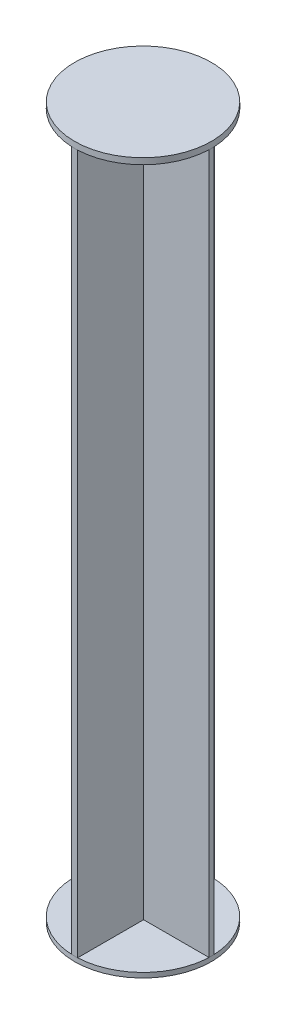
ISO-10303-21;
HEADER;
FILE_DESCRIPTION(('STEP AP214'),'2;1');
FILE_NAME('part.step','',(''),(''),'','','');
FILE_SCHEMA(('AUTOMOTIVE_DESIGN { 1 0 10303 214 1 1 1 1 }'));
ENDSEC;
DATA;
#1=APPLICATION_CONTEXT('core data for automotive mechanical design processes');
#2=APPLICATION_PROTOCOL_DEFINITION('international standard','automotive_design',2000,#1);
#3=PRODUCT_CONTEXT('',#1,'mechanical');
#4=PRODUCT('Part','Part','',(#3));
#5=PRODUCT_RELATED_PRODUCT_CATEGORY('part','',(#4));
#6=PRODUCT_DEFINITION_FORMATION('','',#4);
#7=PRODUCT_DEFINITION_CONTEXT('part definition',#1,'design');
#8=PRODUCT_DEFINITION('design','',#6,#7);
#9=PRODUCT_DEFINITION_SHAPE('','',#8);
#10=(LENGTH_UNIT() NAMED_UNIT(*) SI_UNIT(.MILLI.,.METRE.));
#11=(NAMED_UNIT(*) PLANE_ANGLE_UNIT() SI_UNIT($,.RADIAN.));
#12=(NAMED_UNIT(*) SI_UNIT($,.STERADIAN.) SOLID_ANGLE_UNIT());
#13=UNCERTAINTY_MEASURE_WITH_UNIT(LENGTH_MEASURE(1.E-05),#10,'distance_accuracy_value','');
#14=(GEOMETRIC_REPRESENTATION_CONTEXT(3) GLOBAL_UNCERTAINTY_ASSIGNED_CONTEXT((#13)) GLOBAL_UNIT_ASSIGNED_CONTEXT((#10,
#11,#12)) REPRESENTATION_CONTEXT('',''));
#15=CARTESIAN_POINT('',(0.,0.,0.));
#16=DIRECTION('',(0.,0.,1.));
#17=DIRECTION('',(1.,0.,0.));
#18=AXIS2_PLACEMENT_3D('',#15,#16,#17);
#19=CARTESIAN_POINT('',(0.,115.8,0.));
#20=DIRECTION('',(0.,1.,0.));
#21=DIRECTION('',(0.,0.,1.));
#22=AXIS2_PLACEMENT_3D('',#19,#20,#21);
#23=PLANE('',#22);
#24=DIRECTION('',(0.,0.,-1.));
#25=VECTOR('',#24,1.);
#26=CARTESIAN_POINT('',(-0.5,115.8,11.25));
#27=LINE('',#26,#25);
#28=CARTESIAN_POINT('',(-0.499992884047757,115.8,-11.23904034181));
#29=VERTEX_POINT('',#28);
#30=CARTESIAN_POINT('',(-0.5,115.8,-11.25));
#31=VERTEX_POINT('',#30);
#32=EDGE_CURVE('E249',#29,#31,#27,.T.);
#33=ORIENTED_EDGE('',*,*,#32,.F.);
#34=CARTESIAN_POINT('',(-0.500000018548288,115.8,-11.2391966535701));
#35=CARTESIAN_POINT('',(-0.251080948261474,115.8,-11.2499832612701));
#36=CARTESIAN_POINT('',(0.,115.8,-11.25));
#37=CARTESIAN_POINT('',(0.000388933017916641,115.8,-11.2500000259289));
#38=CARTESIAN_POINT('',(0.000777860932115055,115.8,-11.2500000259627));
#39=B_SPLINE_CURVE_WITH_KNOTS('',2,(#34,#35,#36,#37,#38),.UNSPECIFIED.,.F.,.F.,(3,2,3),
(0.492989743015416,0.5,0.500010866410439),.UNSPECIFIED.);
#40=CARTESIAN_POINT('',(0.000777850721207381,115.8,-11.2499999995357));
#41=VERTEX_POINT('',#40);
#42=EDGE_CURVE('E12',#29,#41,#39,.T.);
#43=ORIENTED_EDGE('',*,*,#42,.T.);
#44=DIRECTION('',(1.,0.,0.));
#45=VECTOR('',#44,1.);
#46=CARTESIAN_POINT('',(-0.5,115.8,-11.25));
#47=LINE('',#46,#45);
#48=EDGE_CURVE('E230',#31,#41,#47,.T.);
#49=ORIENTED_EDGE('',*,*,#48,.F.);
#50=EDGE_LOOP('',(#33,#43,#49));
#51=FACE_BOUND('',#50,.T.);
#52=ADVANCED_FACE('F58',(#51),#23,.T.);
#53=CARTESIAN_POINT('',(0.5,115.8,-11.25));
#54=VERTEX_POINT('',#53);
#55=EDGE_CURVE('E228',#41,#54,#47,.T.);
#56=ORIENTED_EDGE('',*,*,#55,.F.);
#57=CARTESIAN_POINT('',(0.000777860932115055,115.8,-11.2500000259627));
#58=CARTESIAN_POINT('',(0.251448981939054,115.8,-11.2500000477347));
#59=CARTESIAN_POINT('',(0.500000000000019,115.8,-11.2392431539296));
#60=B_SPLINE_CURVE_WITH_KNOTS('',2,(#57,#58,#59),.UNSPECIFIED.,.F.,.F.,(3,3),(0.500010866410439,
0.507014465757992),.UNSPECIFIED.);
#61=CARTESIAN_POINT('',(0.499991796669695,115.8,-11.2390636400938));
#62=VERTEX_POINT('',#61);
#63=EDGE_CURVE('E70',#41,#62,#60,.T.);
#64=ORIENTED_EDGE('',*,*,#63,.T.);
#65=DIRECTION('',(0.,0.,-1.));
#66=VECTOR('',#65,1.);
#67=CARTESIAN_POINT('',(0.5,115.8,11.25));
#68=LINE('',#67,#66);
#69=EDGE_CURVE('E235',#62,#54,#68,.T.);
#70=ORIENTED_EDGE('',*,*,#69,.T.);
#71=EDGE_LOOP('',(#56,#64,#70));
#72=FACE_BOUND('',#71,.T.);
#73=ADVANCED_FACE('F285',(#72),#23,.T.);
#74=DIRECTION('',(1.,0.,0.));
#75=VECTOR('',#74,1.);
#76=CARTESIAN_POINT('',(-0.5,115.8,11.25));
#77=LINE('',#76,#75);
#78=CARTESIAN_POINT('',(-0.5,115.8,11.25));
#79=VERTEX_POINT('',#78);
#80=CARTESIAN_POINT('',(0.,115.8,11.25));
#81=VERTEX_POINT('',#80);
#82=EDGE_CURVE('E268',#79,#81,#77,.T.);
#83=ORIENTED_EDGE('',*,*,#82,.T.);
#84=CARTESIAN_POINT('',(0.,115.8,11.25));
#85=CARTESIAN_POINT('',(-0.251067571600943,115.8,11.25));
#86=CARTESIAN_POINT('',(-0.500000000000012,115.8,11.2392165445393));
#87=B_SPLINE_CURVE_WITH_KNOTS('',2,(#84,#85,#86),.UNSPECIFIED.,.F.,.F.,(3,3),(0.,
0.00701345487662343),.UNSPECIFIED.);
#88=CARTESIAN_POINT('',(-0.499992410309522,115.8,11.2390503081084));
#89=VERTEX_POINT('',#88);
#90=EDGE_CURVE('E77',#81,#89,#87,.T.);
#91=ORIENTED_EDGE('',*,*,#90,.T.);
#92=EDGE_CURVE('E263',#79,#89,#27,.T.);
#93=ORIENTED_EDGE('',*,*,#92,.F.);
#94=EDGE_LOOP('',(#83,#91,#93));
#95=FACE_BOUND('',#94,.T.);
#96=ADVANCED_FACE('F611',(#95),#23,.T.);
#97=CARTESIAN_POINT('',(0.5,115.8,11.25));
#98=VERTEX_POINT('',#97);
#99=CARTESIAN_POINT('',(0.499992256768865,115.8,11.2390536781248));
#100=VERTEX_POINT('',#99);
#101=EDGE_CURVE('E219',#98,#100,#68,.T.);
#102=ORIENTED_EDGE('',*,*,#101,.T.);
#103=CARTESIAN_POINT('',(0.,115.8,0.));
#104=DIRECTION('',(0.,1.,0.));
#105=DIRECTION('',(0.,0.,1.));
#106=AXIS2_PLACEMENT_3D('',#103,#104,#105);
#107=CIRCLE('',#106,11.25);
#108=EDGE_CURVE('E201',#81,#100,#107,.T.);
#109=ORIENTED_EDGE('',*,*,#108,.F.);
#110=EDGE_CURVE('E227',#81,#98,#77,.T.);
#111=ORIENTED_EDGE('',*,*,#110,.T.);
#112=EDGE_LOOP('',(#102,#109,#111));
#113=FACE_BOUND('',#112,.T.);
#114=ADVANCED_FACE('F226',(#113),#23,.T.);
#115=CARTESIAN_POINT('',(0.,0.8,0.));
#116=DIRECTION('',(0.,1.,0.));
#117=DIRECTION('',(0.,0.,1.));
#118=AXIS2_PLACEMENT_3D('',#115,#116,#117);
#119=PLANE('',#118);
#120=CARTESIAN_POINT('',(-11.2431368122212,0.8,0.399881608208691));
#121=CARTESIAN_POINT('',(-11.2371022648922,0.8,0.575100187084233));
#122=CARTESIAN_POINT('',(-11.2270254597995,0.8,0.750185275564195));
#123=CARTESIAN_POINT('',(-11.1987828675933,0.8,1.0987651871348));
#124=CARTESIAN_POINT('',(-11.1806603079024,0.8,1.27226351811985));
#125=CARTESIAN_POINT('',(-11.1363289411508,0.8,1.61767140104678));
#126=CARTESIAN_POINT('',(-11.110145744357,0.8,1.78958423360837));
#127=CARTESIAN_POINT('',(-11.04971494931,0.8,2.1318210715336));
#128=CARTESIAN_POINT('',(-11.0154749133745,0.8,2.30214641203714));
#129=CARTESIAN_POINT('',(-10.9389478313195,0.8,2.64121008557803));
#130=CARTESIAN_POINT('',(-10.8966504414756,0.8,2.80994608282852));
#131=CARTESIAN_POINT('',(-10.8040260345965,0.8,3.14583738007681));
#132=CARTESIAN_POINT('',(-10.7536713725706,0.8,3.31298505938041));
#133=CARTESIAN_POINT('',(-10.6539832145079,0.8,3.61805980800583));
#134=CARTESIAN_POINT('',(-10.6057893389874,0.8,3.75636072727532));
#135=CARTESIAN_POINT('',(-10.5038261089558,0.8,4.03186562456647));
#136=CARTESIAN_POINT('',(-10.4500239798293,0.8,4.16905745179072));
#137=CARTESIAN_POINT('',(-10.3151022454062,0.8,4.4948343304675));
#138=CARTESIAN_POINT('',(-10.2315582080898,0.8,4.68242155489145));
#139=CARTESIAN_POINT('',(-10.0551022551234,0.8,5.05138233450371));
#140=CARTESIAN_POINT('',(-9.96226668944249,0.8,5.23279238219571));
#141=CARTESIAN_POINT('',(-9.78103900375733,0.8,5.56421791628082));
#142=CARTESIAN_POINT('',(-9.69396901099918,0.8,5.71495768857205));
#143=CARTESIAN_POINT('',(-9.51297802348486,0.8,6.01188149241133));
#144=CARTESIAN_POINT('',(-9.41907020493003,0.8,6.15807354962939));
#145=CARTESIAN_POINT('',(-9.22442066633882,0.8,6.44590797969118));
#146=CARTESIAN_POINT('',(-9.12367659817755,0.8,6.58754876438973));
#147=CARTESIAN_POINT('',(-8.91537047030673,0.8,6.86629081540638));
#148=CARTESIAN_POINT('',(-8.807791558606,0.8,7.00337948368777));
#149=CARTESIAN_POINT('',(-8.58053953607552,0.8,7.27945387245167));
#150=CARTESIAN_POINT('',(-8.46052797520128,0.8,7.41816103963735));
#151=CARTESIAN_POINT('',(-8.21305819023556,0.8,7.69062427004085));
#152=CARTESIAN_POINT('',(-8.08555180993848,0.8,7.82433656420631));
#153=CARTESIAN_POINT('',(-7.83619411329542,0.8,8.07372137801353));
#154=CARTESIAN_POINT('',(-7.71487852888197,0.8,8.18993022325182));
#155=CARTESIAN_POINT('',(-7.46805902648496,0.8,8.41612583112336));
#156=CARTESIAN_POINT('',(-7.34258841156314,0.8,8.52614890064356));
#157=CARTESIAN_POINT('',(-7.08115277415386,0.8,8.74527827261076));
#158=CARTESIAN_POINT('',(-6.9449693229303,0.8,8.854124213538));
#159=CARTESIAN_POINT('',(-6.66801268614439,0.8,9.06497797898118));
#160=CARTESIAN_POINT('',(-6.52725350794752,0.8,9.16700419970581));
#161=CARTESIAN_POINT('',(-6.24115750143312,0.8,9.36423242254744));
#162=CARTESIAN_POINT('',(-6.09582347978867,0.8,9.45943849575078));
#163=CARTESIAN_POINT('',(-5.80058833032451,0.8,9.64304110121362));
#164=CARTESIAN_POINT('',(-5.65068016270872,0.8,9.73142631305156));
#165=CARTESIAN_POINT('',(-5.34630864565989,0.8,9.90140212370216));
#166=CARTESIAN_POINT('',(-5.19183002744031,0.8,9.9829653556226));
#167=CARTESIAN_POINT('',(-4.87831674523212,0.8,10.1393159929018));
#168=CARTESIAN_POINT('',(-4.71926030220391,0.8,10.2140597955588));
#169=CARTESIAN_POINT('',(-4.47455892752636,0.8,10.3223053734651));
#170=CARTESIAN_POINT('',(-4.39008225598026,0.8,10.3584749027733));
#171=CARTESIAN_POINT('',(-4.18453276590349,0.8,10.4436301877052));
#172=CARTESIAN_POINT('',(-4.06303464722996,0.8,10.4915962811661));
#173=CARTESIAN_POINT('',(-3.81915166999,0.8,10.583095860544));
#174=CARTESIAN_POINT('',(-3.69677544447694,0.8,10.6266524161711));
#175=CARTESIAN_POINT('',(-3.4081799260429,0.8,10.7237978845123));
#176=CARTESIAN_POINT('',(-3.24138007201122,0.8,10.7756737723475));
#177=CARTESIAN_POINT('',(-2.90616359404475,0.8,10.8713402394877));
#178=CARTESIAN_POINT('',(-2.73775548988233,0.8,10.9151607070415));
#179=CARTESIAN_POINT('',(-2.39932487438189,0.8,10.9947347331331));
#180=CARTESIAN_POINT('',(-2.22930535258686,0.8,11.0305009957792));
#181=CARTESIAN_POINT('',(-1.88765827645858,0.8,11.0939845840252));
#182=CARTESIAN_POINT('',(-1.71602976596804,0.8,11.121696763115));
#183=CARTESIAN_POINT('',(-1.37116869605175,0.8,11.1690864553192));
#184=CARTESIAN_POINT('',(-1.19793295277553,0.8,11.1887407609937));
#185=CARTESIAN_POINT('',(-0.849857038112794,0.8,11.2200473670093));
#186=CARTESIAN_POINT('',(-0.675013182285305,0.8,11.2316587573201));
#187=CARTESIAN_POINT('',(-0.499999801926703,0.8,11.2392232796715));
#188=B_SPLINE_CURVE_WITH_KNOTS('',3,(#120,#121,#122,#123,#124,#125,#126,#127,#128,#129,#130,
#131,#132,#133,#134,#135,#136,#137,#138,#139,#140,#141,#142,#143,#144,#145,#146,#147,#148,#149,
#150,#151,#152,#153,#154,#155,#156,#157,#158,#159,#160,#161,#162,#163,#164,#165,#166,#167,#168,
#169,#170,#171,#172,#173,#174,#175,#176,#177,#178,#179,#180,#181,#182,#183,#184,#185,#186,#187),
.UNSPECIFIED.,.F.,.F.,(4,2,2,2,2,2,2,2,2,2,2,2,2,2,2,2,2,2,2,2,2,2,2,2,2,2,2,2,2,2,2,2,2,4),(0.,
0.525929331367235,1.04906656824752,1.5705585533103,2.09156299399608,2.61324084363082,
3.13674857541746,3.57601343725618,4.01800696747235,4.63375268093014,5.24479971176507,
5.76685021351397,6.28792009104767,6.80916986133571,7.33175884288172,7.8817961995859,
8.43586728903531,8.93969312801887,9.44016107971329,9.96297881093694,10.4843240182094,
11.0053553848905,11.5272336847277,12.051114061791,12.5781384957202,12.8538018991234,
13.2455909780525,13.6352110296959,14.1590526339795,14.6809095541531,15.2019374784884,
15.7232976081401,16.246148930882,16.7716405679655),.UNSPECIFIED.);
#189=CARTESIAN_POINT('',(-11.2463863640491,0.8,0.399936500124632));
#190=VERTEX_POINT('',#189);
#191=CARTESIAN_POINT('',(-0.49999612842836,0.8,11.2391384745375));
#192=VERTEX_POINT('',#191);
#193=EDGE_CURVE('E503',#190,#192,#188,.T.);
#194=ORIENTED_EDGE('',*,*,#193,.T.);
#195=DIRECTION('',(0.,0.,-1.));
#196=VECTOR('',#195,1.);
#197=CARTESIAN_POINT('',(-0.5,0.8,11.25));
#198=LINE('',#197,#196);
#199=CARTESIAN_POINT('',(-0.499999999999997,0.8,0.400000000000005));
#200=VERTEX_POINT('',#199);
#201=EDGE_CURVE('E86',#192,#200,#198,.T.);
#202=ORIENTED_EDGE('',*,*,#201,.T.);
#203=DIRECTION('',(-1.,0.,0.));
#204=VECTOR('',#203,1.);
#205=CARTESIAN_POINT('',(11.25,0.8,0.400000000000004));
#206=LINE('',#205,#204);
#207=EDGE_CURVE('E387',#200,#190,#206,.T.);
#208=ORIENTED_EDGE('',*,*,#207,.T.);
#209=EDGE_LOOP('',(#194,#202,#208));
#210=FACE_BOUND('',#209,.T.);
#211=ADVANCED_FACE('F604',(#210),#119,.T.);
#212=DIRECTION('',(-1.,0.,0.));
#213=VECTOR('',#212,1.);
#214=CARTESIAN_POINT('',(11.25,0.8,-0.399999999999996));
#215=LINE('',#214,#213);
#216=CARTESIAN_POINT('',(-0.5,0.8,-0.399999999999991));
#217=VERTEX_POINT('',#216);
#218=CARTESIAN_POINT('',(-11.2463858884839,0.8,-0.399936580378003));
#219=VERTEX_POINT('',#218);
#220=EDGE_CURVE('E412',#217,#219,#215,.T.);
#221=ORIENTED_EDGE('',*,*,#220,.F.);
#222=CARTESIAN_POINT('',(-0.49999589849518,0.8,-11.2391533969718));
#223=VERTEX_POINT('',#222);
#224=EDGE_CURVE('E422',#217,#223,#198,.T.);
#225=ORIENTED_EDGE('',*,*,#224,.T.);
#226=CARTESIAN_POINT('',(-0.499999783436054,0.8,-11.2392431633021));
#227=CARTESIAN_POINT('',(-0.674953528321706,0.8,-11.2316838734486));
#228=CARTESIAN_POINT('',(-0.849737593653446,0.8,-11.2200762382703));
#229=CARTESIAN_POINT('',(-1.19771544674886,0.8,-11.188775325769));
#230=CARTESIAN_POINT('',(-1.37091282998642,0.8,-11.1691219681651));
#231=CARTESIAN_POINT('',(-1.71571865451728,0.8,-11.1217323523126));
#232=CARTESIAN_POINT('',(-1.88733014137522,0.8,-11.094018288737));
#233=CARTESIAN_POINT('',(-2.22896472626847,0.8,-11.0305291512788));
#234=CARTESIAN_POINT('',(-2.398988592795,0.8,-10.9947582131758));
#235=CARTESIAN_POINT('',(-2.73744947271139,0.8,-10.915172979015));
#236=CARTESIAN_POINT('',(-2.90588326408572,0.8,-10.8713449920423));
#237=CARTESIAN_POINT('',(-3.24117282656203,0.8,-10.7756618358221));
#238=CARTESIAN_POINT('',(-3.40801980987141,0.8,-10.7237758371079));
#239=CARTESIAN_POINT('',(-3.69667487061015,0.8,-10.6266243308314));
#240=CARTESIAN_POINT('',(-3.81906341968192,0.8,-10.5830717841065));
#241=CARTESIAN_POINT('',(-4.06298406549999,0.8,-10.4915832894146));
#242=CARTESIAN_POINT('',(-4.1845074186959,0.8,-10.4436239696268));
#243=CARTESIAN_POINT('',(-4.39010439969636,0.8,-10.3584774931242));
#244=CARTESIAN_POINT('',(-4.47460322842483,0.8,-10.3223101776147));
#245=CARTESIAN_POINT('',(-4.71924872201739,0.8,-10.2141151667663));
#246=CARTESIAN_POINT('',(-4.87822665111499,0.8,-10.1394180200116));
#247=CARTESIAN_POINT('',(-5.19160760264963,0.8,-9.98314662805472));
#248=CARTESIAN_POINT('',(-5.34603183377095,0.8,-9.90161484594519));
#249=CARTESIAN_POINT('',(-5.65031894344068,0.8,-9.73168691308759));
#250=CARTESIAN_POINT('',(-5.80019644479037,0.8,-9.64331697125926));
#251=CARTESIAN_POINT('',(-6.09539483283622,0.8,-9.45973018088495));
#252=CARTESIAN_POINT('',(-6.2407220417214,0.8,-9.36452349823846));
#253=CARTESIAN_POINT('',(-6.52682895871042,0.8,-9.16727917213939));
#254=CARTESIAN_POINT('',(-6.66760508542436,0.8,-9.06523633419185));
#255=CARTESIAN_POINT('',(-6.94462049156858,0.8,-8.85433470640539));
#256=CARTESIAN_POINT('',(-7.08084495060459,0.8,-8.74545645298764));
#257=CARTESIAN_POINT('',(-7.34235276393925,0.8,-8.52627476262558));
#258=CARTESIAN_POINT('',(-7.46785483832905,0.8,-8.41623203534376));
#259=CARTESIAN_POINT('',(-7.71476440154053,0.8,-8.1899892449044));
#260=CARTESIAN_POINT('',(-7.83613791830558,0.8,-8.07375213927284));
#261=CARTESIAN_POINT('',(-8.0855164271386,0.8,-7.82439990693716));
#262=CARTESIAN_POINT('',(-8.2129899275063,0.8,-7.69075254146214));
#263=CARTESIAN_POINT('',(-8.46040593193072,0.8,-7.41838855017276));
#264=CARTESIAN_POINT('',(-8.58039559673166,0.8,-7.27971479540131));
#265=CARTESIAN_POINT('',(-8.80759613877509,0.8,-7.00370957756919));
#266=CARTESIAN_POINT('',(-8.91514594174419,0.8,-6.86665705526967));
#267=CARTESIAN_POINT('',(-9.12341063492863,0.8,-6.58796404454109));
#268=CARTESIAN_POINT('',(-9.22414129749946,0.8,-6.44633534673453));
#269=CARTESIAN_POINT('',(-9.41878105141579,0.8,-6.15850204233978));
#270=CARTESIAN_POINT('',(-9.51269135953344,0.8,-6.01229825865335));
#271=CARTESIAN_POINT('',(-9.69370464596091,0.8,-5.71532795653594));
#272=CARTESIAN_POINT('',(-9.78079329080797,0.8,-5.56455270785982));
#273=CARTESIAN_POINT('',(-9.96206203945449,0.8,-5.23305560133223));
#274=CARTESIAN_POINT('',(-10.054920677789,0.8,-5.05160984835691));
#275=CARTESIAN_POINT('',(-10.2314543053553,0.8,-4.68255052275618));
#276=CARTESIAN_POINT('',(-10.3150512568011,0.8,-4.49489964412719));
#277=CARTESIAN_POINT('',(-10.450019800546,0.8,-4.16910900389874));
#278=CARTESIAN_POINT('',(-10.5038204840205,0.8,-4.03196940779824));
#279=CARTESIAN_POINT('',(-10.6057790023699,0.8,-3.75654765226782));
#280=CARTESIAN_POINT('',(-10.6539689955138,0.8,-3.61827741841753));
#281=CARTESIAN_POINT('',(-10.753637602615,0.8,-3.31328978601053));
#282=CARTESIAN_POINT('',(-10.8039768011374,0.8,-3.14619858937993));
#283=CARTESIAN_POINT('',(-10.89657681095,0.8,-2.81039236635971));
#284=CARTESIAN_POINT('',(-10.9388639825542,0.8,-2.64168460636343));
#285=CARTESIAN_POINT('',(-11.0153776024249,0.8,-2.30264962317462));
#286=CARTESIAN_POINT('',(-11.0496130657074,0.8,-2.13232443545462));
#287=CARTESIAN_POINT('',(-11.1100416157039,0.8,-1.79006001105048));
#288=CARTESIAN_POINT('',(-11.1362257975627,0.8,-1.61811920243937));
#289=CARTESIAN_POINT('',(-11.18056608307,0.8,-1.27262744948338));
#290=CARTESIAN_POINT('',(-11.1986952494403,0.8,-1.09907305494837));
#291=CARTESIAN_POINT('',(-11.2269579047746,0.8,-0.75035291106296));
#292=CARTESIAN_POINT('',(-11.2370468864655,0.8,-0.575183548651556));
#293=CARTESIAN_POINT('',(-11.2430965979663,0.8,-0.39988071168607));
#294=B_SPLINE_CURVE_WITH_KNOTS('',3,(#226,#227,#228,#229,#230,#231,#232,#233,#234,#235,#236,
#237,#238,#239,#240,#241,#242,#243,#244,#245,#246,#247,#248,#249,#250,#251,#252,#253,#254,#255,
#256,#257,#258,#259,#260,#261,#262,#263,#264,#265,#266,#267,#268,#269,#270,#271,#272,#273,#274,
#275,#276,#277,#278,#279,#280,#281,#282,#283,#284,#285,#286,#287,#288,#289,#290,#291,#292,#293),
.UNSPECIFIED.,.F.,.F.,(4,2,2,2,2,2,2,2,2,2,2,2,2,2,2,2,2,2,2,2,2,2,2,2,2,2,2,2,2,2,2,2,2,4),(0.,
0.52531194871232,1.0480484995589,1.56935913614602,2.09040277936955,2.61234012864174,
3.13632594436939,3.52597701949371,3.9178292136342,4.19355101757252,4.7203023505997,
5.24399423325185,5.76576988347179,6.286785133216,6.80820087124707,7.33117531934547,
7.83175360217246,8.33576388294064,8.88962555891363,9.43954352239341,9.96199322129397,
10.483190028808,11.0042936236347,11.5264643055162,12.1376389942009,12.7536242644612,
13.1954701363771,13.6346438785899,14.1579758535103,14.6795639507997,15.2005652469503,
15.7221407237936,16.2454475416307,16.7716314384217),.UNSPECIFIED.);
#295=EDGE_CURVE('E499',#223,#219,#294,.T.);
#296=ORIENTED_EDGE('',*,*,#295,.T.);
#297=EDGE_LOOP('',(#221,#225,#296));
#298=FACE_BOUND('',#297,.T.);
#299=ADVANCED_FACE('F606',(#298),#119,.T.);
#300=CARTESIAN_POINT('',(0.499999806140077,0.8,11.2392165529371));
#301=CARTESIAN_POINT('',(0.674973268824913,0.8,11.2316493226634));
#302=CARTESIAN_POINT('',(0.849776993773163,0.8,11.2200351250942));
#303=CARTESIAN_POINT('',(1.19778735285435,0.8,11.1887235144566));
#304=CARTESIAN_POINT('',(1.37099761065254,0.8,11.1690663236612));
#305=CARTESIAN_POINT('',(1.71582238448934,0.8,11.1216714664003));
#306=CARTESIAN_POINT('',(1.8874399903614,0.8,11.0939563163601));
#307=CARTESIAN_POINT('',(2.22907998873233,0.8,11.0304674071005));
#308=CARTESIAN_POINT('',(2.39910321162198,0.8,10.994698116912));
#309=CARTESIAN_POINT('',(2.73755596601841,0.8,10.9151185785177));
#310=CARTESIAN_POINT('',(2.9059823550622,0.8,10.87129497668));
#311=CARTESIAN_POINT('',(3.24125024805495,0.8,10.7756229662241));
#312=CARTESIAN_POINT('',(3.40808305981526,0.8,10.7237440617611));
#313=CARTESIAN_POINT('',(3.69671779959375,0.8,10.6266035776242));
#314=CARTESIAN_POINT('',(3.81910011382014,0.8,10.5830547913629));
#315=CARTESIAN_POINT('',(4.06300435139046,0.8,10.4915744088588));
#316=CARTESIAN_POINT('',(4.18451757616469,0.8,10.4436195605153));
#317=CARTESIAN_POINT('',(4.39008781580371,0.8,10.3584845036713));
#318=CARTESIAN_POINT('',(4.47457013893712,0.8,10.3223243901365));
#319=CARTESIAN_POINT('',(4.71920041411646,0.8,10.2141373357435));
#320=CARTESIAN_POINT('',(4.87817950121802,0.8,10.1394406128824));
#321=CARTESIAN_POINT('',(5.19156269653205,0.8,9.9831699345282));
#322=CARTESIAN_POINT('',(5.34598801444106,0.8,9.90163844468643));
#323=CARTESIAN_POINT('',(5.65027726686564,0.8,9.73171105570771));
#324=CARTESIAN_POINT('',(5.80015582503452,0.8,9.64334136727452));
#325=CARTESIAN_POINT('',(6.09535628480961,0.8,9.45975501860753));
#326=CARTESIAN_POINT('',(6.24068450950631,0.8,9.36454852582068));
#327=CARTESIAN_POINT('',(6.52679341923534,0.8,9.1673045211767));
#328=CARTESIAN_POINT('',(6.66757052373677,0.8,9.065261816026));
#329=CARTESIAN_POINT('',(6.94458784547902,0.8,8.85436039453805));
#330=CARTESIAN_POINT('',(7.08081324308941,0.8,8.74548221547288));
#331=CARTESIAN_POINT('',(7.34232746561092,0.8,8.52629674433618));
#332=CARTESIAN_POINT('',(7.46783483979118,0.8,8.41624996030404));
#333=CARTESIAN_POINT('',(7.71475467356556,0.8,8.18999856120536));
#334=CARTESIAN_POINT('',(7.8361331574332,0.8,8.07375689952943));
#335=CARTESIAN_POINT('',(8.08551272941624,0.8,7.82440360439533));
#336=CARTESIAN_POINT('',(8.21298270590117,0.8,7.69076011324902));
#337=CARTESIAN_POINT('',(8.46039209285442,0.8,7.41840416012696));
#338=CARTESIAN_POINT('',(8.58037866039963,0.8,7.27973456598214));
#339=CARTESIAN_POINT('',(8.80757718085262,0.8,7.00373337132688));
#340=CARTESIAN_POINT('',(8.91512783422334,0.8,6.86668052787771));
#341=CARTESIAN_POINT('',(9.12339416883957,0.8,6.58798683526669));
#342=CARTESIAN_POINT('',(9.22412562341366,0.8,6.44635777751775));
#343=CARTESIAN_POINT('',(9.41876690252866,0.8,6.15852371349551));
#344=CARTESIAN_POINT('',(9.51267794462944,0.8,6.01231953066107));
#345=CARTESIAN_POINT('',(9.69369264021391,0.8,5.715348391127));
#346=CARTESIAN_POINT('',(9.78078196079622,0.8,5.56457270448129));
#347=CARTESIAN_POINT('',(9.96205348265116,0.8,5.23307209585722));
#348=CARTESIAN_POINT('',(10.0549140715857,0.8,5.05162319470671));
#349=CARTESIAN_POINT('',(10.2314512649185,0.8,4.68255734739003));
#350=CARTESIAN_POINT('',(10.3150498277916,0.8,4.49490309333719));
#351=CARTESIAN_POINT('',(10.450018941813,0.8,4.16911107685391));
#352=CARTESIAN_POINT('',(10.5038188447419,0.8,4.03197358658272));
#353=CARTESIAN_POINT('',(10.6057759751537,0.8,3.75655607772982));
#354=CARTESIAN_POINT('',(10.6539653595369,0.8,3.61828798424238));
#355=CARTESIAN_POINT('',(10.7536338758692,0.8,3.31330185735428));
#356=CARTESIAN_POINT('',(10.8039734774697,0.8,3.14620998655178));
#357=CARTESIAN_POINT('',(10.896574224014,0.8,2.81040240133333));
#358=CARTESIAN_POINT('',(10.9388617299682,0.8,2.64169395353049));
#359=CARTESIAN_POINT('',(11.0153759494871,0.8,2.30265758075214));
#360=CARTESIAN_POINT('',(11.0496116784841,0.8,2.13233169135091));
#361=CARTESIAN_POINT('',(11.1100406911339,0.8,1.79006584979186));
#362=CARTESIAN_POINT('',(11.1362250700478,0.8,1.61812432572212));
#363=CARTESIAN_POINT('',(11.1805656811369,0.8,1.27263112812936));
#364=CARTESIAN_POINT('',(11.1986949758416,0.8,1.0990760043807));
#365=CARTESIAN_POINT('',(11.2269578198745,0.8,0.75035438835755));
#366=CARTESIAN_POINT('',(11.2370468614346,0.8,0.575184282972974));
#367=CARTESIAN_POINT('',(11.2430965983034,0.8,0.399880701938382));
#368=B_SPLINE_CURVE_WITH_KNOTS('',3,(#300,#301,#302,#303,#304,#305,#306,#307,#308,#309,#310,
#311,#312,#313,#314,#315,#316,#317,#318,#319,#320,#321,#322,#323,#324,#325,#326,#327,#328,#329,
#330,#331,#332,#333,#334,#335,#336,#337,#338,#339,#340,#341,#342,#343,#344,#345,#346,#347,#348,
#349,#350,#351,#352,#353,#354,#355,#356,#357,#358,#359,#360,#361,#362,#363,#364,#365,#366,#367),
.UNSPECIFIED.,.F.,.F.,(4,2,2,2,2,2,2,2,2,2,2,2,2,2,2,2,2,2,2,2,2,2,2,2,2,2,2,2,2,2,2,2,2,4),(0.,
0.525372179497389,1.04814852311604,1.56947788191506,2.09051867848028,2.61243125685515,
3.13637016902672,3.52599981421967,3.91781879480752,4.19348658741621,4.72024052581337,
5.24393487671427,5.7657128711001,6.28673035487226,6.80814823151101,7.33112473812659,
7.83172297884671,8.3357534546144,8.88959944386864,9.43950190811863,9.96195393661681,
10.4831529990556,11.0042587887025,11.5264316202737,12.1376173651374,12.7536138347543,
13.1954529757755,13.6346200588051,14.1579543161576,14.6795446565188,15.2005481710064,
15.722125856275,16.2454348874821,16.7716210173136),.UNSPECIFIED.);
#369=CARTESIAN_POINT('',(0.499996205196087,0.8,11.2391334262937));
#370=VERTEX_POINT('',#369);
#371=CARTESIAN_POINT('',(11.2463858935335,0.8,0.399936575435317));
#372=VERTEX_POINT('',#371);
#373=EDGE_CURVE('E477',#370,#372,#368,.T.);
#374=ORIENTED_EDGE('',*,*,#373,.T.);
#375=CARTESIAN_POINT('',(0.5,0.8,0.400000000000008));
#376=VERTEX_POINT('',#375);
#377=EDGE_CURVE('E395',#372,#376,#206,.T.);
#378=ORIENTED_EDGE('',*,*,#377,.T.);
#379=DIRECTION('',(0.,0.,-1.));
#380=VECTOR('',#379,1.);
#381=CARTESIAN_POINT('',(0.5,0.8,11.25));
#382=LINE('',#381,#380);
#383=EDGE_CURVE('E435',#370,#376,#382,.T.);
#384=ORIENTED_EDGE('',*,*,#383,.F.);
#385=EDGE_LOOP('',(#374,#378,#384));
#386=FACE_BOUND('',#385,.T.);
#387=ADVANCED_FACE('F475',(#386),#119,.T.);
#388=CARTESIAN_POINT('',(0.,0.8,0.));
#389=DIRECTION('',(0.,-1.,0.));
#390=DIRECTION('',(0.,0.,-1.));
#391=AXIS2_PLACEMENT_3D('',#388,#389,#390);
#392=CYLINDRICAL_SURFACE('',#391,11.25);
#393=CARTESIAN_POINT('',(0.,0.8,11.25));
#394=CARTESIAN_POINT('',(0.251067571600948,0.8,11.25));
#395=CARTESIAN_POINT('',(0.500000000000012,0.8,11.2392165445393));
#396=B_SPLINE_CURVE_WITH_KNOTS('',2,(#393,#394,#395),.UNSPECIFIED.,.F.,.F.,(3,3),(0.,
0.00701345487662219),.UNSPECIFIED.);
#397=CARTESIAN_POINT('',(0.,0.8,11.25));
#398=VERTEX_POINT('',#397);
#399=EDGE_CURVE('E481',#398,#370,#396,.T.);
#400=ORIENTED_EDGE('',*,*,#399,.F.);
#401=CARTESIAN_POINT('',(-0.50000000400197,0.8,11.239223270923));
#402=CARTESIAN_POINT('',(-0.251076719432093,0.8,11.25));
#403=CARTESIAN_POINT('',(0.,0.8,11.25));
#404=B_SPLINE_CURVE_WITH_KNOTS('',2,(#401,#402,#403),.UNSPECIFIED.,.F.,.F.,(3,3),
(0.992988732851958,1.),.UNSPECIFIED.);
#405=EDGE_CURVE('E508',#192,#398,#404,.T.);
#406=ORIENTED_EDGE('',*,*,#405,.F.);
#407=ORIENTED_EDGE('',*,*,#193,.F.);
#408=CARTESIAN_POINT('',(0.,0.8,0.));
#409=DIRECTION('',(0.,-1.,0.));
#410=DIRECTION('',(-0.999368103313658,0.,0.035544255221652));
#411=AXIS2_PLACEMENT_3D('',#408,#409,#410);
#412=CIRCLE('',#411,11.25);
#413=EDGE_CURVE('E396',#190,#219,#412,.T.);
#414=ORIENTED_EDGE('',*,*,#413,.T.);
#415=ORIENTED_EDGE('',*,*,#295,.F.);
#416=CARTESIAN_POINT('',(-0.000777860932111027,0.8,-11.2500000259626));
#417=CARTESIAN_POINT('',(-0.251448981939006,0.8,-11.2500000477347));
#418=CARTESIAN_POINT('',(-0.500000000000012,0.8,-11.2392431539296));
#419=B_SPLINE_CURVE_WITH_KNOTS('',2,(#416,#417,#418),.UNSPECIFIED.,.F.,.F.,(3,3),
(0.500010866410439,0.507014465758002),.UNSPECIFIED.);
#420=CARTESIAN_POINT('',(-0.000777860928449168,0.8,-11.2499999995354));
#421=VERTEX_POINT('',#420);
#422=EDGE_CURVE('E494',#421,#223,#419,.T.);
#423=ORIENTED_EDGE('',*,*,#422,.F.);
#424=CARTESIAN_POINT('',(0.500000018548288,0.8,-11.2391966535701));
#425=CARTESIAN_POINT('',(0.25108094826149,0.8,-11.2499832612701));
#426=CARTESIAN_POINT('',(0.,0.8,-11.25));
#427=CARTESIAN_POINT('',(-0.00038893301791325,0.8,-11.2500000259289));
#428=CARTESIAN_POINT('',(-0.000777860932111027,0.8,-11.2500000259626));
#429=B_SPLINE_CURVE_WITH_KNOTS('',2,(#424,#425,#426,#427,#428),.UNSPECIFIED.,.F.,.F.,(3,2,3),
(0.492989743015419,0.5,0.500010866410439),.UNSPECIFIED.);
#430=CARTESIAN_POINT('',(0.499996442190575,0.8,-11.2391184977346));
#431=VERTEX_POINT('',#430);
#432=EDGE_CURVE('E488',#431,#421,#429,.T.);
#433=ORIENTED_EDGE('',*,*,#432,.F.);
#434=CARTESIAN_POINT('',(11.2431368122212,0.8,-0.399881608208144));
#435=CARTESIAN_POINT('',(11.2371022394603,0.8,-0.575100930206574));
#436=CARTESIAN_POINT('',(11.2270253744339,0.8,-0.750186760708918));
#437=CARTESIAN_POINT('',(11.1987825934275,0.8,-1.09876814276926));
#438=CARTESIAN_POINT('',(11.1806599053476,0.8,-1.2722672022691));
#439=CARTESIAN_POINT('',(11.1363282129327,0.8,-1.61767652868765));
#440=CARTESIAN_POINT('',(11.1101448190388,0.8,-1.78959007625878));
#441=CARTESIAN_POINT('',(11.0497135612767,0.8,-2.13182833069513));
#442=CARTESIAN_POINT('',(11.0154732595923,0.8,-2.30215437268129));
#443=CARTESIAN_POINT('',(10.9389455778464,0.8,-2.64121943566956));
#444=CARTESIAN_POINT('',(10.8966478536276,0.8,-2.80995612077819));
#445=CARTESIAN_POINT('',(10.8040227099971,0.8,-3.145848780585));
#446=CARTESIAN_POINT('',(10.7536676448831,0.8,-3.31299713436375));
#447=CARTESIAN_POINT('',(10.6539795778151,0.8,-3.61807037746327));
#448=CARTESIAN_POINT('',(10.6057863112062,0.8,-3.75636915602868));
#449=CARTESIAN_POINT('',(10.5038244693791,0.8,-4.0318698053143));
#450=CARTESIAN_POINT('',(10.4500231209441,0.8,-4.16905952573292));
#451=CARTESIAN_POINT('',(10.3151008180599,0.8,-4.4948377767292));
#452=CARTESIAN_POINT('',(10.2315551709789,0.8,-4.68242837365859));
#453=CARTESIAN_POINT('',(10.0550956548675,0.8,-5.05139567038591));
#454=CARTESIAN_POINT('',(9.96225813944777,0.8,-5.23280886452164));
#455=CARTESIAN_POINT('',(9.78102768126793,0.8,-5.56423789945269));
#456=CARTESIAN_POINT('',(9.69395701257483,0.8,-5.71497811017211));
#457=CARTESIAN_POINT('',(9.51296461543375,0.8,-6.01190275259412));
#458=CARTESIAN_POINT('',(9.41905606261167,0.8,-6.15809520965564));
#459=CARTESIAN_POINT('',(9.22440499817773,0.8,-6.44593040098226));
#460=CARTESIAN_POINT('',(9.12366013764117,0.8,-6.5875715465529));
#461=CARTESIAN_POINT('',(8.91535236752589,0.8,-6.86631428156461));
#462=CARTESIAN_POINT('',(8.80777260497308,0.8,-7.00340327216698));
#463=CARTESIAN_POINT('',(8.58052260282818,0.8,-7.27947364065348));
#464=CARTESIAN_POINT('',(8.46051413828058,0.8,-7.41817664880419));
#465=CARTESIAN_POINT('',(8.21305096943584,0.8,-7.69063184237608));
#466=CARTESIAN_POINT('',(8.0855481126888,0.8,-7.82434026203437));
#467=CARTESIAN_POINT('',(7.83618935826556,0.8,-8.07372613340016));
#468=CARTESIAN_POINT('',(7.71486881271237,0.8,-8.18993952999156));
#469=CARTESIAN_POINT('',(7.46803905000316,0.8,-8.41614373842837));
#470=CARTESIAN_POINT('',(7.3425631394932,0.8,-8.52617086119958));
#471=CARTESIAN_POINT('',(7.0811210961523,0.8,-8.74530401155588));
#472=CARTESIAN_POINT('',(6.94493670534812,0.8,-8.85414987917513));
#473=CARTESIAN_POINT('',(6.66797815079121,0.8,-9.06500344061389));
#474=CARTESIAN_POINT('',(6.52721799363236,0.8,-9.16702952977264));
#475=CARTESIAN_POINT('',(6.2411199918659,0.8,-9.36425743382504));
#476=CARTESIAN_POINT('',(6.09578495306729,0.8,-9.45946331858654));
#477=CARTESIAN_POINT('',(5.80054772901849,0.8,-9.64306548537065));
#478=CARTESIAN_POINT('',(5.65063850306759,0.8,-9.73145044540803));
#479=CARTESIAN_POINT('',(5.34626484007989,0.8,-9.90142571560383));
#480=CARTESIAN_POINT('',(5.19178513340547,0.8,-9.98298865707676));
#481=CARTESIAN_POINT('',(4.87826960384221,0.8,-10.1393385844363));
#482=CARTESIAN_POINT('',(4.71921200089715,0.8,-10.2140819650403));
#483=CARTESIAN_POINT('',(4.47452584157587,0.8,-10.3223195886414));
#484=CARTESIAN_POINT('',(4.39006567396002,0.8,-10.3584819149401));
#485=CARTESIAN_POINT('',(4.18454294441335,0.8,-10.4436257683202));
#486=CARTESIAN_POINT('',(4.06305497504911,0.8,-10.4915873797036));
#487=CARTESIAN_POINT('',(3.81918844304635,0.8,-10.5830788285251));
#488=CARTESIAN_POINT('',(3.69681846829728,0.8,-10.6266316154927));
#489=CARTESIAN_POINT('',(3.40824328669236,0.8,-10.7237660512644));
#490=CARTESIAN_POINT('',(3.24145760412519,0.8,-10.7756348423751));
#491=CARTESIAN_POINT('',(2.90626279346399,0.8,-10.871290161168));
#492=CARTESIAN_POINT('',(2.73786208945935,0.8,-10.9151062431566));
#493=CARTESIAN_POINT('',(2.39943959303522,0.8,-10.9946745748073));
#494=CARTESIAN_POINT('',(2.2294207105939,0.8,-11.0304391911601));
#495=CARTESIAN_POINT('',(1.88776821026951,0.8,-11.0939225564389));
#496=CARTESIAN_POINT('',(1.7161335743529,0.8,-11.121635825651));
#497=CARTESIAN_POINT('',(1.37125354010458,0.8,-11.1690307684409));
#498=CARTESIAN_POINT('',(1.19800491368883,0.8,-11.1886889130571));
#499=CARTESIAN_POINT('',(0.849896473736207,0.8,-11.2200062301636));
#500=CARTESIAN_POINT('',(0.675032947579155,0.8,-11.2316241904549));
#501=CARTESIAN_POINT('',(0.499999838588973,0.8,-11.2391966613685));
#502=B_SPLINE_CURVE_WITH_KNOTS('',3,(#434,#435,#436,#437,#438,#439,#440,#441,#442,#443,#444,
#445,#446,#447,#448,#449,#450,#451,#452,#453,#454,#455,#456,#457,#458,#459,#460,#461,#462,#463,
#464,#465,#466,#467,#468,#469,#470,#471,#472,#473,#474,#475,#476,#477,#478,#479,#480,#481,#482,
#483,#484,#485,#486,#487,#488,#489,#490,#491,#492,#493,#494,#495,#496,#497,#498,#499,#500,#501),
.UNSPECIFIED.,.F.,.F.,(4,2,2,2,2,2,2,2,2,2,2,2,2,2,2,2,2,2,2,2,2,2,2,2,2,2,2,2,2,2,2,2,2,4),(0.,
0.525931561571506,1.04907100975216,1.57056520193561,2.09157186040748,2.61325195329543,
3.13676196839712,3.57602016990603,4.0180069663166,4.63376386904936,5.24482195022006,
5.7668746031664,6.28794667777161,6.80919870594133,7.33179002070015,7.88181188352785,
8.43586728647382,8.93971329773249,9.44020119083777,9.96302098490035,10.48436833585,
11.0054019423222,11.5272825927177,12.0511654449793,12.5781924917073,12.8538018870504,
13.2455576822298,13.6351562503937,14.1589509490376,14.6807831044278,15.2018081958806,
15.7231870685828,16.2460782114891,16.7716301130287),.UNSPECIFIED.);
#503=CARTESIAN_POINT('',(11.2463863640494,0.8,-0.399936500124346));
#504=VERTEX_POINT('',#503);
#505=EDGE_CURVE('E486',#504,#431,#502,.T.);
#506=ORIENTED_EDGE('',*,*,#505,.F.);
#507=CARTESIAN_POINT('',(11.25,0.799999999999995,0.400000000000004));
#508=DIRECTION('',(0.,0.,-1.));
#509=VECTOR('',#508,1.);
#510=LINE('',#507,#509);
#511=EDGE_CURVE('E563',#372,#504,#510,.T.);
#512=ORIENTED_EDGE('',*,*,#511,.F.);
#513=ORIENTED_EDGE('',*,*,#373,.F.);
#514=EDGE_LOOP('',(#400,#406,#407,#414,#415,#423,#433,#506,#512,#513));
#515=FACE_BOUND('',#514,.T.);
#516=CARTESIAN_POINT('',(0.,0.,0.));
#517=DIRECTION('',(0.,1.,0.));
#518=DIRECTION('',(0.,0.,1.));
#519=AXIS2_PLACEMENT_3D('',#516,#517,#518);
#520=CIRCLE('',#519,11.25);
#521=CARTESIAN_POINT('',(0.,0.,11.25));
#522=VERTEX_POINT('',#521);
#523=EDGE_CURVE('E512',#522,#522,#520,.T.);
#524=ORIENTED_EDGE('',*,*,#523,.T.);
#525=EDGE_LOOP('',(#524));
#526=FACE_BOUND('',#525,.T.);
#527=ADVANCED_FACE('F60',(#515,#526),#392,.T.);
#528=CARTESIAN_POINT('',(0.500000000000004,0.8,-0.399999999999995));
#529=VERTEX_POINT('',#528);
#530=EDGE_CURVE('E831',#529,#431,#382,.T.);
#531=ORIENTED_EDGE('',*,*,#530,.F.);
#532=EDGE_CURVE('E409',#504,#529,#215,.T.);
#533=ORIENTED_EDGE('',*,*,#532,.F.);
#534=ORIENTED_EDGE('',*,*,#505,.T.);
#535=EDGE_LOOP('',(#531,#533,#534));
#536=FACE_BOUND('',#535,.T.);
#537=ADVANCED_FACE('F455',(#536),#119,.T.);
#538=CARTESIAN_POINT('',(0.,0.,0.));
#539=DIRECTION('',(0.,1.,0.));
#540=DIRECTION('',(0.,0.,1.));
#541=AXIS2_PLACEMENT_3D('',#538,#539,#540);
#542=PLANE('',#541);
#543=ORIENTED_EDGE('',*,*,#523,.F.);
#544=EDGE_LOOP('',(#543));
#545=FACE_BOUND('',#544,.T.);
#546=ADVANCED_FACE('F613',(#545),#542,.F.);
#547=CARTESIAN_POINT('',(0.,0.8,0.));
#548=DIRECTION('',(0.,1.,0.));
#549=DIRECTION('',(0.,0.,1.));
#550=AXIS2_PLACEMENT_3D('',#547,#548,#549);
#551=PLANE('',#550);
#552=CARTESIAN_POINT('',(0.5,0.8,-11.25));
#553=VERTEX_POINT('',#552);
#554=EDGE_CURVE('E829',#431,#553,#382,.T.);
#555=ORIENTED_EDGE('',*,*,#554,.F.);
#556=ORIENTED_EDGE('',*,*,#432,.T.);
#557=DIRECTION('',(1.,0.,0.));
#558=VECTOR('',#557,1.);
#559=CARTESIAN_POINT('',(-0.5,0.8,-11.25));
#560=LINE('',#559,#558);
#561=EDGE_CURVE('E826',#421,#553,#560,.T.);
#562=ORIENTED_EDGE('',*,*,#561,.T.);
#563=EDGE_LOOP('',(#555,#556,#562));
#564=FACE_BOUND('',#563,.T.);
#565=ADVANCED_FACE('F289',(#564),#551,.F.);
#566=CARTESIAN_POINT('',(-0.5,0.8,-11.25));
#567=VERTEX_POINT('',#566);
#568=EDGE_CURVE('E332',#567,#421,#560,.T.);
#569=ORIENTED_EDGE('',*,*,#568,.T.);
#570=ORIENTED_EDGE('',*,*,#422,.T.);
#571=EDGE_CURVE('E423',#223,#567,#198,.T.);
#572=ORIENTED_EDGE('',*,*,#571,.T.);
#573=EDGE_LOOP('',(#569,#570,#572));
#574=FACE_BOUND('',#573,.T.);
#575=ADVANCED_FACE('F642',(#574),#551,.F.);
#576=DIRECTION('',(1.,0.,0.));
#577=VECTOR('',#576,1.);
#578=CARTESIAN_POINT('',(-0.5,0.8,11.25));
#579=LINE('',#578,#577);
#580=CARTESIAN_POINT('',(0.5,0.8,11.25));
#581=VERTEX_POINT('',#580);
#582=EDGE_CURVE('E416',#398,#581,#579,.T.);
#583=ORIENTED_EDGE('',*,*,#582,.F.);
#584=ORIENTED_EDGE('',*,*,#399,.T.);
#585=EDGE_CURVE('E480',#581,#370,#382,.T.);
#586=ORIENTED_EDGE('',*,*,#585,.F.);
#587=EDGE_LOOP('',(#583,#584,#586));
#588=FACE_BOUND('',#587,.T.);
#589=ADVANCED_FACE('F653',(#588),#551,.F.);
#590=CARTESIAN_POINT('',(-0.5,0.8,11.25));
#591=VERTEX_POINT('',#590);
#592=EDGE_CURVE('E269',#591,#192,#198,.T.);
#593=ORIENTED_EDGE('',*,*,#592,.T.);
#594=ORIENTED_EDGE('',*,*,#405,.T.);
#595=EDGE_CURVE('E832',#591,#398,#579,.T.);
#596=ORIENTED_EDGE('',*,*,#595,.F.);
#597=EDGE_LOOP('',(#593,#594,#596));
#598=FACE_BOUND('',#597,.T.);
#599=ADVANCED_FACE('F643',(#598),#551,.F.);
#600=CARTESIAN_POINT('',(-0.5,115.8,11.25));
#601=DIRECTION('',(0.,0.,-1.));
#602=DIRECTION('',(-1.,0.,0.));
#603=AXIS2_PLACEMENT_3D('',#600,#601,#602);
#604=PLANE('',#603);
#605=ORIENTED_EDGE('',*,*,#595,.T.);
#606=ORIENTED_EDGE('',*,*,#582,.T.);
#607=DIRECTION('',(0.,-1.,0.));
#608=VECTOR('',#607,1.);
#609=CARTESIAN_POINT('',(0.5,115.8,11.25));
#610=LINE('',#609,#608);
#611=EDGE_CURVE('E337',#98,#581,#610,.T.);
#612=ORIENTED_EDGE('',*,*,#611,.F.);
#613=ORIENTED_EDGE('',*,*,#110,.F.);
#614=ORIENTED_EDGE('',*,*,#82,.F.);
#615=DIRECTION('',(0.,-1.,0.));
#616=VECTOR('',#615,1.);
#617=CARTESIAN_POINT('',(-0.5,115.8,11.25));
#618=LINE('',#617,#616);
#619=EDGE_CURVE('E266',#79,#591,#618,.T.);
#620=ORIENTED_EDGE('',*,*,#619,.T.);
#621=EDGE_LOOP('',(#605,#606,#612,#613,#614,#620));
#622=FACE_BOUND('',#621,.T.);
#623=ADVANCED_FACE('F670',(#622),#604,.F.);
#624=CARTESIAN_POINT('',(0.5,115.8,11.25));
#625=DIRECTION('',(-1.,0.,0.));
#626=DIRECTION('',(0.,0.,1.));
#627=AXIS2_PLACEMENT_3D('',#624,#625,#626);
#628=PLANE('',#627);
#629=ORIENTED_EDGE('',*,*,#585,.T.);
#630=ORIENTED_EDGE('',*,*,#383,.T.);
#631=DIRECTION('',(0.,1.,0.));
#632=VECTOR('',#631,1.);
#633=CARTESIAN_POINT('',(0.5,115.8,0.400000000000006));
#634=LINE('',#633,#632);
#635=CARTESIAN_POINT('',(0.500000000000004,115.8,0.400000000000005));
#636=VERTEX_POINT('',#635);
#637=EDGE_CURVE('E223',#376,#636,#634,.T.);
#638=ORIENTED_EDGE('',*,*,#637,.T.);
#639=EDGE_CURVE('E194',#100,#636,#68,.T.);
#640=ORIENTED_EDGE('',*,*,#639,.F.);
#641=ORIENTED_EDGE('',*,*,#101,.F.);
#642=ORIENTED_EDGE('',*,*,#611,.T.);
#643=EDGE_LOOP('',(#629,#630,#638,#640,#641,#642));
#644=FACE_BOUND('',#643,.T.);
#645=ADVANCED_FACE('F217',(#644),#628,.F.);
#646=CARTESIAN_POINT('',(-0.5,115.8,11.25));
#647=DIRECTION('',(-1.,0.,0.));
#648=DIRECTION('',(0.,0.,1.));
#649=AXIS2_PLACEMENT_3D('',#646,#647,#648);
#650=PLANE('',#649);
#651=DIRECTION('',(0.,1.,0.));
#652=VECTOR('',#651,1.);
#653=CARTESIAN_POINT('',(-0.5,115.8,0.400000000000006));
#654=LINE('',#653,#652);
#655=CARTESIAN_POINT('',(-0.5,115.8,0.400000000000008));
#656=VERTEX_POINT('',#655);
#657=EDGE_CURVE('E343',#200,#656,#654,.T.);
#658=ORIENTED_EDGE('',*,*,#657,.F.);
#659=ORIENTED_EDGE('',*,*,#201,.F.);
#660=ORIENTED_EDGE('',*,*,#592,.F.);
#661=ORIENTED_EDGE('',*,*,#619,.F.);
#662=ORIENTED_EDGE('',*,*,#92,.T.);
#663=EDGE_CURVE('E261',#89,#656,#27,.T.);
#664=ORIENTED_EDGE('',*,*,#663,.T.);
#665=EDGE_LOOP('',(#658,#659,#660,#661,#662,#664));
#666=FACE_BOUND('',#665,.T.);
#667=ADVANCED_FACE('F718',(#666),#650,.T.);
#668=DIRECTION('',(0.,1.,0.));
#669=VECTOR('',#668,1.);
#670=CARTESIAN_POINT('',(0.5,115.8,-0.399999999999994));
#671=LINE('',#670,#669);
#672=CARTESIAN_POINT('',(0.5,115.8,-0.399999999999991));
#673=VERTEX_POINT('',#672);
#674=EDGE_CURVE('E517',#529,#673,#671,.T.);
#675=ORIENTED_EDGE('',*,*,#674,.F.);
#676=ORIENTED_EDGE('',*,*,#530,.T.);
#677=ORIENTED_EDGE('',*,*,#554,.T.);
#678=DIRECTION('',(0.,-1.,0.));
#679=VECTOR('',#678,1.);
#680=CARTESIAN_POINT('',(0.5,115.8,-11.25));
#681=LINE('',#680,#679);
#682=EDGE_CURVE('E335',#54,#553,#681,.T.);
#683=ORIENTED_EDGE('',*,*,#682,.F.);
#684=ORIENTED_EDGE('',*,*,#69,.F.);
#685=EDGE_CURVE('E224',#673,#62,#68,.T.);
#686=ORIENTED_EDGE('',*,*,#685,.F.);
#687=EDGE_LOOP('',(#675,#676,#677,#683,#684,#686));
#688=FACE_BOUND('',#687,.T.);
#689=ADVANCED_FACE('F720',(#688),#628,.F.);
#690=CARTESIAN_POINT('',(-0.5,115.8,-11.25));
#691=DIRECTION('',(0.,0.,-1.));
#692=DIRECTION('',(-1.,0.,0.));
#693=AXIS2_PLACEMENT_3D('',#690,#691,#692);
#694=PLANE('',#693);
#695=ORIENTED_EDGE('',*,*,#568,.F.);
#696=DIRECTION('',(0.,-1.,0.));
#697=VECTOR('',#696,1.);
#698=CARTESIAN_POINT('',(-0.5,115.8,-11.25));
#699=LINE('',#698,#697);
#700=EDGE_CURVE('E329',#31,#567,#699,.T.);
#701=ORIENTED_EDGE('',*,*,#700,.F.);
#702=ORIENTED_EDGE('',*,*,#48,.T.);
#703=ORIENTED_EDGE('',*,*,#55,.T.);
#704=ORIENTED_EDGE('',*,*,#682,.T.);
#705=ORIENTED_EDGE('',*,*,#561,.F.);
#706=EDGE_LOOP('',(#695,#701,#702,#703,#704,#705));
#707=FACE_BOUND('',#706,.T.);
#708=ADVANCED_FACE('F327',(#707),#694,.T.);
#709=ORIENTED_EDGE('',*,*,#224,.F.);
#710=DIRECTION('',(0.,1.,0.));
#711=VECTOR('',#710,1.);
#712=CARTESIAN_POINT('',(-0.5,115.8,-0.399999999999994));
#713=LINE('',#712,#711);
#714=CARTESIAN_POINT('',(-0.499999999999997,115.8,-0.399999999999995));
#715=VERTEX_POINT('',#714);
#716=EDGE_CURVE('E821',#217,#715,#713,.T.);
#717=ORIENTED_EDGE('',*,*,#716,.T.);
#718=EDGE_CURVE('E251',#715,#29,#27,.T.);
#719=ORIENTED_EDGE('',*,*,#718,.T.);
#720=ORIENTED_EDGE('',*,*,#32,.T.);
#721=ORIENTED_EDGE('',*,*,#700,.T.);
#722=ORIENTED_EDGE('',*,*,#571,.F.);
#723=EDGE_LOOP('',(#709,#717,#719,#720,#721,#722));
#724=FACE_BOUND('',#723,.T.);
#725=ADVANCED_FACE('F729',(#724),#650,.T.);
#726=CARTESIAN_POINT('',(11.25,115.8,-0.399999999999996));
#727=DIRECTION('',(0.,0.,1.));
#728=DIRECTION('',(1.,0.,0.));
#729=AXIS2_PLACEMENT_3D('',#726,#727,#728);
#730=PLANE('',#729);
#731=ORIENTED_EDGE('',*,*,#716,.F.);
#732=ORIENTED_EDGE('',*,*,#220,.T.);
#733=DIRECTION('',(0.,-1.,0.));
#734=VECTOR('',#733,1.);
#735=CARTESIAN_POINT('',(-11.25,115.8,-0.399999999999993));
#736=LINE('',#735,#734);
#737=CARTESIAN_POINT('',(-11.2463845921761,115.8,-0.39993456681571));
#738=VERTEX_POINT('',#737);
#739=EDGE_CURVE('E417',#738,#219,#736,.T.);
#740=ORIENTED_EDGE('',*,*,#739,.F.);
#741=DIRECTION('',(-1.,0.,0.));
#742=VECTOR('',#741,1.);
#743=CARTESIAN_POINT('',(11.25,115.8,-0.399999999999996));
#744=LINE('',#743,#742);
#745=EDGE_CURVE('E353',#715,#738,#744,.T.);
#746=ORIENTED_EDGE('',*,*,#745,.F.);
#747=EDGE_LOOP('',(#731,#732,#740,#746));
#748=FACE_BOUND('',#747,.T.);
#749=ADVANCED_FACE('F375',(#748),#730,.F.);
#750=CARTESIAN_POINT('',(-11.25,115.8,0.400000000000007));
#751=DIRECTION('',(-1.,0.,0.));
#752=DIRECTION('',(0.,0.,1.));
#753=AXIS2_PLACEMENT_3D('',#750,#751,#752);
#754=PLANE('',#753);
#755=ORIENTED_EDGE('',*,*,#413,.F.);
#756=DIRECTION('',(0.,-1.,0.));
#757=VECTOR('',#756,1.);
#758=CARTESIAN_POINT('',(-11.25,115.8,0.400000000000007));
#759=LINE('',#758,#757);
#760=CARTESIAN_POINT('',(-11.2463842327578,115.8,0.399934768471119));
#761=VERTEX_POINT('',#760);
#762=EDGE_CURVE('E397',#761,#190,#759,.T.);
#763=ORIENTED_EDGE('',*,*,#762,.F.);
#764=CARTESIAN_POINT('',(-11.25,115.8,0.400000000000007));
#765=DIRECTION('',(0.,0.,-1.));
#766=VECTOR('',#765,1.);
#767=LINE('',#764,#766);
#768=EDGE_CURVE('E359',#761,#738,#767,.T.);
#769=ORIENTED_EDGE('',*,*,#768,.T.);
#770=ORIENTED_EDGE('',*,*,#739,.T.);
#771=EDGE_LOOP('',(#755,#763,#769,#770));
#772=FACE_BOUND('',#771,.T.);
#773=ADVANCED_FACE('F364',(#772),#754,.T.);
#774=CARTESIAN_POINT('',(11.25,115.8,0.400000000000004));
#775=DIRECTION('',(0.,0.,1.));
#776=DIRECTION('',(1.,0.,0.));
#777=AXIS2_PLACEMENT_3D('',#774,#775,#776);
#778=PLANE('',#777);
#779=ORIENTED_EDGE('',*,*,#207,.F.);
#780=ORIENTED_EDGE('',*,*,#657,.T.);
#781=DIRECTION('',(-1.,0.,0.));
#782=VECTOR('',#781,1.);
#783=CARTESIAN_POINT('',(11.25,115.8,0.400000000000004));
#784=LINE('',#783,#782);
#785=EDGE_CURVE('E356',#656,#761,#784,.T.);
#786=ORIENTED_EDGE('',*,*,#785,.T.);
#787=ORIENTED_EDGE('',*,*,#762,.T.);
#788=EDGE_LOOP('',(#779,#780,#786,#787));
#789=FACE_BOUND('',#788,.T.);
#790=ADVANCED_FACE('F374',(#789),#778,.T.);
#791=CARTESIAN_POINT('',(11.25,115.8,0.400000000000004));
#792=DIRECTION('',(-1.,0.,0.));
#793=DIRECTION('',(0.,0.,1.));
#794=AXIS2_PLACEMENT_3D('',#791,#792,#793);
#795=PLANE('',#794);
#796=ORIENTED_EDGE('',*,*,#511,.T.);
#797=DIRECTION('',(0.,-1.,0.));
#798=VECTOR('',#797,1.);
#799=CARTESIAN_POINT('',(11.25,115.8,-0.399999999999996));
#800=LINE('',#799,#798);
#801=CARTESIAN_POINT('',(11.2463842277081,115.8,-0.39993477341379));
#802=VERTEX_POINT('',#801);
#803=EDGE_CURVE('E413',#802,#504,#800,.T.);
#804=ORIENTED_EDGE('',*,*,#803,.F.);
#805=CARTESIAN_POINT('',(0.,115.8,0.));
#806=DIRECTION('',(0.,1.,0.));
#807=DIRECTION('',(0.999368114516333,0.,0.0355439402440211));
#808=AXIS2_PLACEMENT_3D('',#805,#806,#807);
#809=CIRCLE('',#808,11.25);
#810=CARTESIAN_POINT('',(11.2463845921758,115.8,0.399934566815989));
#811=VERTEX_POINT('',#810);
#812=EDGE_CURVE('E355',#811,#802,#809,.T.);
#813=ORIENTED_EDGE('',*,*,#812,.F.);
#814=DIRECTION('',(0.,-1.,0.));
#815=VECTOR('',#814,1.);
#816=CARTESIAN_POINT('',(11.25,115.8,0.400000000000004));
#817=LINE('',#816,#815);
#818=EDGE_CURVE('E464',#811,#372,#817,.T.);
#819=ORIENTED_EDGE('',*,*,#818,.T.);
#820=EDGE_LOOP('',(#796,#804,#813,#819));
#821=FACE_BOUND('',#820,.T.);
#822=ADVANCED_FACE('F444',(#821),#795,.F.);
#823=ORIENTED_EDGE('',*,*,#532,.T.);
#824=ORIENTED_EDGE('',*,*,#674,.T.);
#825=EDGE_CURVE('E350',#802,#673,#744,.T.);
#826=ORIENTED_EDGE('',*,*,#825,.F.);
#827=ORIENTED_EDGE('',*,*,#803,.T.);
#828=EDGE_LOOP('',(#823,#824,#826,#827));
#829=FACE_BOUND('',#828,.T.);
#830=ADVANCED_FACE('F453',(#829),#730,.F.);
#831=ORIENTED_EDGE('',*,*,#637,.F.);
#832=ORIENTED_EDGE('',*,*,#377,.F.);
#833=ORIENTED_EDGE('',*,*,#818,.F.);
#834=EDGE_CURVE('E197',#811,#636,#784,.T.);
#835=ORIENTED_EDGE('',*,*,#834,.T.);
#836=EDGE_LOOP('',(#831,#832,#833,#835));
#837=FACE_BOUND('',#836,.T.);
#838=ADVANCED_FACE('F454',(#837),#778,.T.);
#839=CARTESIAN_POINT('',(0.,115.8,0.));
#840=DIRECTION('',(0.,1.,0.));
#841=DIRECTION('',(0.,0.,1.));
#842=AXIS2_PLACEMENT_3D('',#839,#840,#841);
#843=PLANE('',#842);
#844=CARTESIAN_POINT('',(0.,115.8,0.));
#845=DIRECTION('',(0.,1.,0.));
#846=DIRECTION('',(0.0444431034457478,0.,0.99901191712417));
#847=AXIS2_PLACEMENT_3D('',#844,#845,#846);
#848=CIRCLE('',#847,11.25);
#849=EDGE_CURVE('E190',#100,#811,#848,.T.);
#850=ORIENTED_EDGE('',*,*,#849,.F.);
#851=ORIENTED_EDGE('',*,*,#639,.T.);
#852=ORIENTED_EDGE('',*,*,#834,.F.);
#853=EDGE_LOOP('',(#850,#851,#852));
#854=FACE_BOUND('',#853,.T.);
#855=ADVANCED_FACE('F192',(#854),#843,.F.);
#856=CARTESIAN_POINT('',(0.,115.8,0.));
#857=DIRECTION('',(0.,1.,0.));
#858=DIRECTION('',(0.999368112191683,0.,-0.0355440056047699));
#859=AXIS2_PLACEMENT_3D('',#856,#857,#858);
#860=CIRCLE('',#859,11.25);
#861=EDGE_CURVE('E202',#802,#62,#860,.T.);
#862=ORIENTED_EDGE('',*,*,#861,.F.);
#863=ORIENTED_EDGE('',*,*,#825,.T.);
#864=ORIENTED_EDGE('',*,*,#685,.T.);
#865=EDGE_LOOP('',(#862,#863,#864));
#866=FACE_BOUND('',#865,.T.);
#867=ADVANCED_FACE('F578',(#866),#843,.F.);
#868=ORIENTED_EDGE('',*,*,#718,.F.);
#869=ORIENTED_EDGE('',*,*,#745,.T.);
#870=CARTESIAN_POINT('',(0.,115.8,0.));
#871=DIRECTION('',(0.,1.,0.));
#872=DIRECTION('',(-0.044443209759521,0.,-0.999011912394578));
#873=AXIS2_PLACEMENT_3D('',#870,#871,#872);
#874=CIRCLE('',#873,11.25);
#875=EDGE_CURVE('E873',#29,#738,#874,.T.);
#876=ORIENTED_EDGE('',*,*,#875,.F.);
#877=EDGE_LOOP('',(#868,#869,#876));
#878=FACE_BOUND('',#877,.T.);
#879=ADVANCED_FACE('F571',(#878),#843,.F.);
#880=CARTESIAN_POINT('',(0.,116.8,0.));
#881=DIRECTION('',(0.,-1.,0.));
#882=DIRECTION('',(0.,0.,-1.));
#883=AXIS2_PLACEMENT_3D('',#880,#881,#882);
#884=CYLINDRICAL_SURFACE('',#883,11.25);
#885=CARTESIAN_POINT('',(0.,116.8,0.));
#886=DIRECTION('',(0.,1.,0.));
#887=DIRECTION('',(0.,0.,1.));
#888=AXIS2_PLACEMENT_3D('',#885,#886,#887);
#889=CIRCLE('',#888,11.25);
#890=CARTESIAN_POINT('',(0.,116.8,11.25));
#891=VERTEX_POINT('',#890);
#892=EDGE_CURVE('E211',#891,#891,#889,.T.);
#893=ORIENTED_EDGE('',*,*,#892,.F.);
#894=EDGE_LOOP('',(#893));
#895=FACE_BOUND('',#894,.T.);
#896=ORIENTED_EDGE('',*,*,#108,.T.);
#897=ORIENTED_EDGE('',*,*,#849,.T.);
#898=ORIENTED_EDGE('',*,*,#812,.T.);
#899=ORIENTED_EDGE('',*,*,#861,.T.);
#900=ORIENTED_EDGE('',*,*,#63,.F.);
#901=ORIENTED_EDGE('',*,*,#42,.F.);
#902=ORIENTED_EDGE('',*,*,#875,.T.);
#903=ORIENTED_EDGE('',*,*,#768,.F.);
#904=CARTESIAN_POINT('',(0.,115.8,0.));
#905=DIRECTION('',(0.,1.,0.));
#906=DIRECTION('',(-0.999368112222498,0.,0.0355440047383569));
#907=AXIS2_PLACEMENT_3D('',#904,#905,#906);
#908=CIRCLE('',#907,11.25);
#909=EDGE_CURVE('E868',#761,#89,#908,.T.);
#910=ORIENTED_EDGE('',*,*,#909,.T.);
#911=ORIENTED_EDGE('',*,*,#90,.F.);
#912=EDGE_LOOP('',(#896,#897,#898,#899,#900,#901,#902,#903,#910,#911));
#913=FACE_BOUND('',#912,.T.);
#914=ADVANCED_FACE('F206',(#895,#913),#884,.T.);
#915=CARTESIAN_POINT('',(0.,116.8,0.));
#916=DIRECTION('',(0.,1.,0.));
#917=DIRECTION('',(0.,0.,1.));
#918=AXIS2_PLACEMENT_3D('',#915,#916,#917);
#919=PLANE('',#918);
#920=ORIENTED_EDGE('',*,*,#892,.T.);
#921=EDGE_LOOP('',(#920));
#922=FACE_BOUND('',#921,.T.);
#923=ADVANCED_FACE('F568',(#922),#919,.T.);
#924=ORIENTED_EDGE('',*,*,#785,.F.);
#925=ORIENTED_EDGE('',*,*,#663,.F.);
#926=ORIENTED_EDGE('',*,*,#909,.F.);
#927=EDGE_LOOP('',(#924,#925,#926));
#928=FACE_BOUND('',#927,.T.);
#929=ADVANCED_FACE('F576',(#928),#843,.F.);
#930=CLOSED_SHELL('',(#52,#73,#96,#114,#211,#299,#387,#527,#537,#546,#565,#575,#589,#599,#623,
#645,#667,#689,#708,#725,#749,#773,#790,#822,#830,#838,#855,#867,#879,#914,#923,#929));
#931=MANIFOLD_SOLID_BREP('B2',#930);
#932=ADVANCED_BREP_SHAPE_REPRESENTATION('',(#18,#931),#14);
#933=SHAPE_DEFINITION_REPRESENTATION(#9,#932);
ENDSEC;
END-ISO-10303-21;
